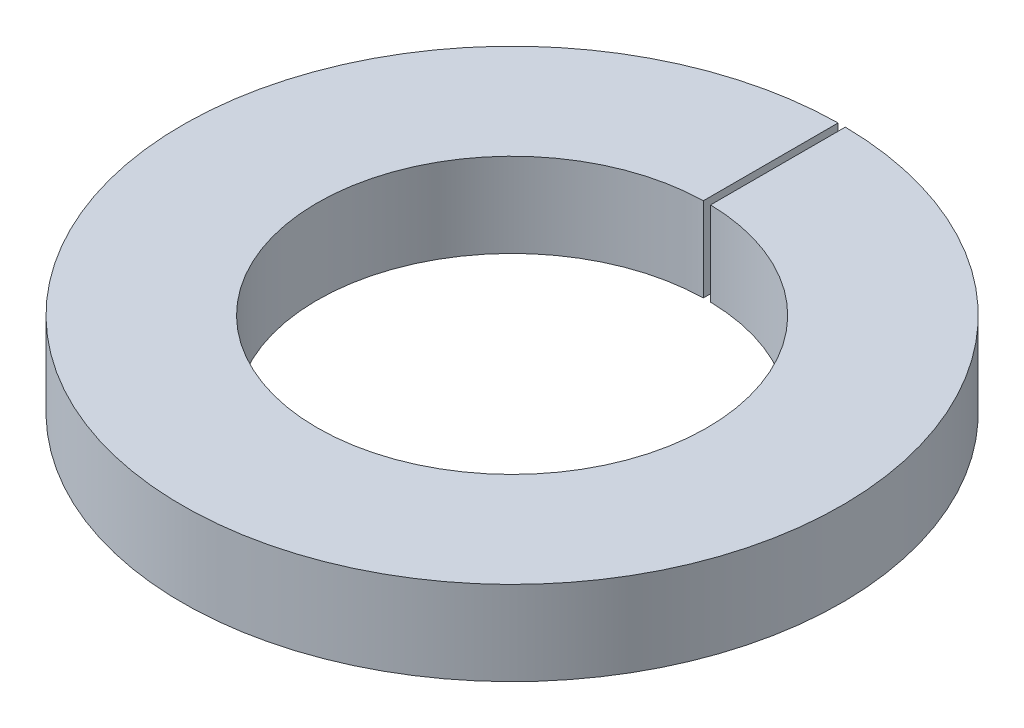
ISO-10303-21;
HEADER;
FILE_DESCRIPTION(('STEP AP214'),'2;1');
FILE_NAME('part.step','',(''),(''),'','','');
FILE_SCHEMA(('AUTOMOTIVE_DESIGN { 1 0 10303 214 1 1 1 1 }'));
ENDSEC;
DATA;
#1=APPLICATION_CONTEXT('core data for automotive mechanical design processes');
#2=APPLICATION_PROTOCOL_DEFINITION('international standard','automotive_design',2000,#1);
#3=PRODUCT_CONTEXT('',#1,'mechanical');
#4=PRODUCT('Part','Part','',(#3));
#5=PRODUCT_RELATED_PRODUCT_CATEGORY('part','',(#4));
#6=PRODUCT_DEFINITION_FORMATION('','',#4);
#7=PRODUCT_DEFINITION_CONTEXT('part definition',#1,'design');
#8=PRODUCT_DEFINITION('design','',#6,#7);
#9=PRODUCT_DEFINITION_SHAPE('','',#8);
#10=(LENGTH_UNIT() NAMED_UNIT(*) SI_UNIT(.MILLI.,.METRE.));
#11=(NAMED_UNIT(*) PLANE_ANGLE_UNIT() SI_UNIT($,.RADIAN.));
#12=(NAMED_UNIT(*) SI_UNIT($,.STERADIAN.) SOLID_ANGLE_UNIT());
#13=UNCERTAINTY_MEASURE_WITH_UNIT(LENGTH_MEASURE(1.E-05),#10,'distance_accuracy_value','');
#14=(GEOMETRIC_REPRESENTATION_CONTEXT(3) GLOBAL_UNCERTAINTY_ASSIGNED_CONTEXT((#13)) GLOBAL_UNIT_ASSIGNED_CONTEXT((#10,
#11,#12)) REPRESENTATION_CONTEXT('',''));
#15=CARTESIAN_POINT('',(0.,0.,0.));
#16=DIRECTION('',(0.,0.,1.));
#17=DIRECTION('',(1.,0.,0.));
#18=AXIS2_PLACEMENT_3D('',#15,#16,#17);
#19=CARTESIAN_POINT('',(0.,3.5,0.));
#20=DIRECTION('',(0.,1.,0.));
#21=DIRECTION('',(0.,0.,1.));
#22=AXIS2_PLACEMENT_3D('',#19,#20,#21);
#23=PLANE('',#22);
#24=DIRECTION('',(0.,0.,-1.));
#25=VECTOR('',#24,1.);
#26=CARTESIAN_POINT('',(0.149999999999975,3.5,-40.));
#27=LINE('',#26,#25);
#28=CARTESIAN_POINT('',(0.149999999999995,3.5,-8.09861099201585));
#29=VERTEX_POINT('',#28);
#30=CARTESIAN_POINT('',(0.149999999999992,3.5,-13.6991788075052));
#31=VERTEX_POINT('',#30);
#32=EDGE_CURVE('E79',#29,#31,#27,.T.);
#33=ORIENTED_EDGE('',*,*,#32,.F.);
#34=CARTESIAN_POINT('',(0.,3.5,0.));
#35=DIRECTION('',(0.,1.,0.));
#36=DIRECTION('',(0.,0.,1.));
#37=AXIS2_PLACEMENT_3D('',#34,#35,#36);
#38=CIRCLE('',#37,8.1);
#39=CARTESIAN_POINT('',(-0.15,3.5,-8.09861099201585));
#40=VERTEX_POINT('',#39);
#41=EDGE_CURVE('E88',#40,#29,#38,.T.);
#42=ORIENTED_EDGE('',*,*,#41,.F.);
#43=DIRECTION('',(0.,0.,1.));
#44=VECTOR('',#43,1.);
#45=CARTESIAN_POINT('',(-0.15,3.5,0.));
#46=LINE('',#45,#44);
#47=CARTESIAN_POINT('',(-0.15,3.5,-13.6991788075052));
#48=VERTEX_POINT('',#47);
#49=EDGE_CURVE('E62',#48,#40,#46,.T.);
#50=ORIENTED_EDGE('',*,*,#49,.F.);
#51=CARTESIAN_POINT('',(0.,3.5,0.));
#52=DIRECTION('',(0.,1.,0.));
#53=DIRECTION('',(0.,0.,1.));
#54=AXIS2_PLACEMENT_3D('',#51,#52,#53);
#55=CIRCLE('',#54,13.7);
#56=EDGE_CURVE('E90',#48,#31,#55,.T.);
#57=ORIENTED_EDGE('',*,*,#56,.T.);
#58=EDGE_LOOP('',(#33,#42,#50,#57));
#59=FACE_BOUND('',#58,.T.);
#60=ADVANCED_FACE('F40',(#59),#23,.T.);
#61=CARTESIAN_POINT('',(0.,0.,0.));
#62=DIRECTION('',(0.,1.,0.));
#63=DIRECTION('',(0.,0.,1.));
#64=AXIS2_PLACEMENT_3D('',#61,#62,#63);
#65=PLANE('',#64);
#66=CARTESIAN_POINT('',(0.,0.,0.));
#67=DIRECTION('',(0.,1.,0.));
#68=DIRECTION('',(0.,0.,1.));
#69=AXIS2_PLACEMENT_3D('',#66,#67,#68);
#70=CIRCLE('',#69,8.1);
#71=CARTESIAN_POINT('',(-0.15,0.,-8.09861099201585));
#72=VERTEX_POINT('',#71);
#73=CARTESIAN_POINT('',(0.149999999999995,0.,-8.09861099201585));
#74=VERTEX_POINT('',#73);
#75=EDGE_CURVE('E94',#72,#74,#70,.T.);
#76=ORIENTED_EDGE('',*,*,#75,.T.);
#77=DIRECTION('',(0.,0.,-1.));
#78=VECTOR('',#77,1.);
#79=CARTESIAN_POINT('',(0.149999999999975,0.,-40.));
#80=LINE('',#79,#78);
#81=CARTESIAN_POINT('',(0.149999999999992,0.,-13.6991788075052));
#82=VERTEX_POINT('',#81);
#83=EDGE_CURVE('E54',#74,#82,#80,.T.);
#84=ORIENTED_EDGE('',*,*,#83,.T.);
#85=CARTESIAN_POINT('',(0.,0.,0.));
#86=DIRECTION('',(0.,1.,0.));
#87=DIRECTION('',(0.,0.,1.));
#88=AXIS2_PLACEMENT_3D('',#85,#86,#87);
#89=CIRCLE('',#88,13.7);
#90=CARTESIAN_POINT('',(-0.15,0.,-13.6991788075052));
#91=VERTEX_POINT('',#90);
#92=EDGE_CURVE('E93',#91,#82,#89,.T.);
#93=ORIENTED_EDGE('',*,*,#92,.F.);
#94=DIRECTION('',(0.,0.,1.));
#95=VECTOR('',#94,1.);
#96=CARTESIAN_POINT('',(-0.15,0.,0.));
#97=LINE('',#96,#95);
#98=EDGE_CURVE('E105',#91,#72,#97,.T.);
#99=ORIENTED_EDGE('',*,*,#98,.T.);
#100=EDGE_LOOP('',(#76,#84,#93,#99));
#101=FACE_BOUND('',#100,.T.);
#102=ADVANCED_FACE('F109',(#101),#65,.F.);
#103=CARTESIAN_POINT('',(0.,3.5,0.));
#104=DIRECTION('',(0.,-1.,0.));
#105=DIRECTION('',(0.,0.,-1.));
#106=AXIS2_PLACEMENT_3D('',#103,#104,#105);
#107=CYLINDRICAL_SURFACE('',#106,13.7);
#108=ORIENTED_EDGE('',*,*,#92,.T.);
#109=DIRECTION('',(0.,-1.,0.));
#110=VECTOR('',#109,1.);
#111=CARTESIAN_POINT('',(0.149999999999992,3.5,-13.6991788075052));
#112=LINE('',#111,#110);
#113=EDGE_CURVE('E98',#82,#31,#112,.F.);
#114=ORIENTED_EDGE('',*,*,#113,.T.);
#115=ORIENTED_EDGE('',*,*,#56,.F.);
#116=DIRECTION('',(0.,-1.,0.));
#117=VECTOR('',#116,1.);
#118=CARTESIAN_POINT('',(-0.15,3.5,-13.6991788075052));
#119=LINE('',#118,#117);
#120=EDGE_CURVE('E110',#48,#91,#119,.T.);
#121=ORIENTED_EDGE('',*,*,#120,.T.);
#122=EDGE_LOOP('',(#108,#114,#115,#121));
#123=FACE_BOUND('',#122,.T.);
#124=ADVANCED_FACE('F42',(#123),#107,.T.);
#125=CARTESIAN_POINT('',(0.,3.5,0.));
#126=DIRECTION('',(0.,-1.,0.));
#127=DIRECTION('',(0.,0.,-1.));
#128=AXIS2_PLACEMENT_3D('',#125,#126,#127);
#129=CYLINDRICAL_SURFACE('',#128,8.1);
#130=DIRECTION('',(0.,-1.,0.));
#131=VECTOR('',#130,1.);
#132=CARTESIAN_POINT('',(0.149999999999995,3.5,-8.09861099201585));
#133=LINE('',#132,#131);
#134=EDGE_CURVE('E11',#74,#29,#133,.F.);
#135=ORIENTED_EDGE('',*,*,#134,.F.);
#136=ORIENTED_EDGE('',*,*,#75,.F.);
#137=DIRECTION('',(0.,-1.,0.));
#138=VECTOR('',#137,1.);
#139=CARTESIAN_POINT('',(-0.15,3.5,-8.09861099201585));
#140=LINE('',#139,#138);
#141=EDGE_CURVE('E48',#40,#72,#140,.T.);
#142=ORIENTED_EDGE('',*,*,#141,.F.);
#143=ORIENTED_EDGE('',*,*,#41,.T.);
#144=EDGE_LOOP('',(#135,#136,#142,#143));
#145=FACE_BOUND('',#144,.T.);
#146=ADVANCED_FACE('F92',(#145),#129,.F.);
#147=CARTESIAN_POINT('',(-0.15,0.,0.));
#148=DIRECTION('',(-1.,0.,0.));
#149=DIRECTION('',(0.,0.,1.));
#150=AXIS2_PLACEMENT_3D('',#147,#148,#149);
#151=PLANE('',#150);
#152=ORIENTED_EDGE('',*,*,#49,.T.);
#153=ORIENTED_EDGE('',*,*,#141,.T.);
#154=ORIENTED_EDGE('',*,*,#98,.F.);
#155=ORIENTED_EDGE('',*,*,#120,.F.);
#156=EDGE_LOOP('',(#152,#153,#154,#155));
#157=FACE_BOUND('',#156,.T.);
#158=ADVANCED_FACE('F104',(#157),#151,.F.);
#159=CARTESIAN_POINT('',(0.149999999999975,0.,-40.));
#160=DIRECTION('',(1.,0.,0.));
#161=DIRECTION('',(0.,0.,-1.));
#162=AXIS2_PLACEMENT_3D('',#159,#160,#161);
#163=PLANE('',#162);
#164=ORIENTED_EDGE('',*,*,#83,.F.);
#165=ORIENTED_EDGE('',*,*,#134,.T.);
#166=ORIENTED_EDGE('',*,*,#32,.T.);
#167=ORIENTED_EDGE('',*,*,#113,.F.);
#168=EDGE_LOOP('',(#164,#165,#166,#167));
#169=FACE_BOUND('',#168,.T.);
#170=ADVANCED_FACE('F78',(#169),#163,.F.);
#171=CLOSED_SHELL('',(#60,#102,#124,#146,#158,#170));
#172=MANIFOLD_SOLID_BREP('B2',#171);
#173=ADVANCED_BREP_SHAPE_REPRESENTATION('',(#18,#172),#14);
#174=SHAPE_DEFINITION_REPRESENTATION(#9,#173);
ENDSEC;
END-ISO-10303-21;
